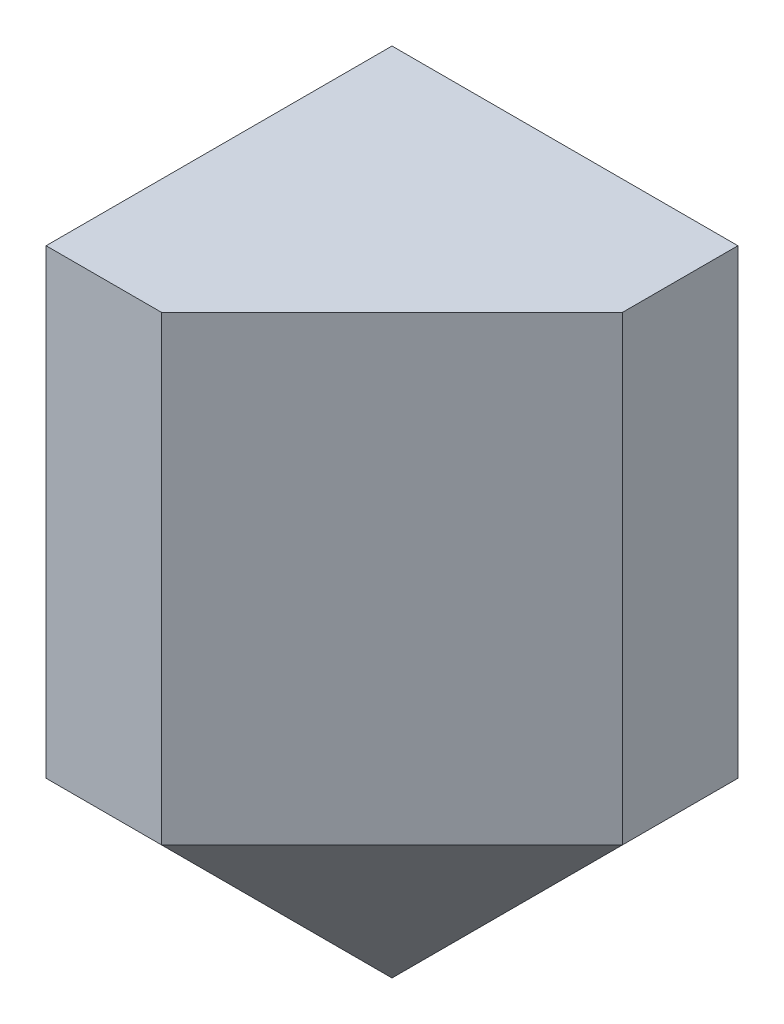
ISO-10303-21;
HEADER;
FILE_DESCRIPTION(('STEP AP214'),'2;1');
FILE_NAME('part.step','',(''),(''),'','','');
FILE_SCHEMA(('AUTOMOTIVE_DESIGN { 1 0 10303 214 1 1 1 1 }'));
ENDSEC;
DATA;
#1=APPLICATION_CONTEXT('core data for automotive mechanical design processes');
#2=APPLICATION_PROTOCOL_DEFINITION('international standard','automotive_design',2000,#1);
#3=PRODUCT_CONTEXT('',#1,'mechanical');
#4=PRODUCT('Part','Part','',(#3));
#5=PRODUCT_RELATED_PRODUCT_CATEGORY('part','',(#4));
#6=PRODUCT_DEFINITION_FORMATION('','',#4);
#7=PRODUCT_DEFINITION_CONTEXT('part definition',#1,'design');
#8=PRODUCT_DEFINITION('design','',#6,#7);
#9=PRODUCT_DEFINITION_SHAPE('','',#8);
#10=(LENGTH_UNIT() NAMED_UNIT(*) SI_UNIT(.MILLI.,.METRE.));
#11=(NAMED_UNIT(*) PLANE_ANGLE_UNIT() SI_UNIT($,.RADIAN.));
#12=(NAMED_UNIT(*) SI_UNIT($,.STERADIAN.) SOLID_ANGLE_UNIT());
#13=UNCERTAINTY_MEASURE_WITH_UNIT(LENGTH_MEASURE(1.E-05),#10,'distance_accuracy_value','');
#14=(GEOMETRIC_REPRESENTATION_CONTEXT(3) GLOBAL_UNCERTAINTY_ASSIGNED_CONTEXT((#13)) GLOBAL_UNIT_ASSIGNED_CONTEXT((#10,
#11,#12)) REPRESENTATION_CONTEXT('',''));
#15=CARTESIAN_POINT('',(0.,0.,0.));
#16=DIRECTION('',(0.,0.,1.));
#17=DIRECTION('',(1.,0.,0.));
#18=AXIS2_PLACEMENT_3D('',#15,#16,#17);
#19=CARTESIAN_POINT('',(0.,0.,30.));
#20=DIRECTION('',(1.,0.,0.));
#21=DIRECTION('',(0.,0.,-1.));
#22=AXIS2_PLACEMENT_3D('',#19,#20,#21);
#23=PLANE('',#22);
#24=CARTESIAN_POINT('',(0.,20.,18.));
#25=DIRECTION('',(-1.,0.,0.));
#26=DIRECTION('',(0.,0.,1.));
#27=AXIS2_PLACEMENT_3D('',#24,#25,#26);
#28=CIRCLE('',#27,2.74999999999999);
#29=CARTESIAN_POINT('',(0.,20.,20.75));
#30=VERTEX_POINT('',#29);
#31=EDGE_CURVE('E128',#30,#30,#28,.T.);
#32=ORIENTED_EDGE('',*,*,#31,.F.);
#33=EDGE_LOOP('',(#32));
#34=FACE_BOUND('',#33,.T.);
#35=CARTESIAN_POINT('',(0.,48.,18.));
#36=DIRECTION('',(-1.,0.,0.));
#37=DIRECTION('',(0.,0.,1.));
#38=AXIS2_PLACEMENT_3D('',#35,#36,#37);
#39=CIRCLE('',#38,2.75);
#40=CARTESIAN_POINT('',(0.,48.,20.75));
#41=VERTEX_POINT('',#40);
#42=EDGE_CURVE('E134',#41,#41,#39,.T.);
#43=ORIENTED_EDGE('',*,*,#42,.F.);
#44=EDGE_LOOP('',(#43));
#45=FACE_BOUND('',#44,.T.);
#46=DIRECTION('',(0.,0.,-1.));
#47=VECTOR('',#46,1.);
#48=CARTESIAN_POINT('',(0.,0.,30.));
#49=LINE('',#48,#47);
#50=CARTESIAN_POINT('',(0.,0.,9.99999999999995));
#51=VERTEX_POINT('',#50);
#52=CARTESIAN_POINT('',(0.,0.,0.));
#53=VERTEX_POINT('',#52);
#54=EDGE_CURVE('E159',#51,#53,#49,.T.);
#55=ORIENTED_EDGE('',*,*,#54,.F.);
#56=DIRECTION('',(0.,-0.707106781186546,-0.707106781186549));
#57=VECTOR('',#56,1.);
#58=CARTESIAN_POINT('',(0.,20.,30.));
#59=LINE('',#58,#57);
#60=CARTESIAN_POINT('',(0.,20.,30.));
#61=VERTEX_POINT('',#60);
#62=EDGE_CURVE('E11',#51,#61,#59,.F.);
#63=ORIENTED_EDGE('',*,*,#62,.T.);
#64=DIRECTION('',(0.,-1.,0.));
#65=VECTOR('',#64,1.);
#66=CARTESIAN_POINT('',(0.,0.,30.));
#67=LINE('',#66,#65);
#68=CARTESIAN_POINT('',(0.,60.,30.));
#69=VERTEX_POINT('',#68);
#70=EDGE_CURVE('E156',#69,#61,#67,.T.);
#71=ORIENTED_EDGE('',*,*,#70,.F.);
#72=DIRECTION('',(0.,0.,1.));
#73=VECTOR('',#72,1.);
#74=CARTESIAN_POINT('',(0.,60.,30.));
#75=LINE('',#74,#73);
#76=CARTESIAN_POINT('',(0.,60.,0.));
#77=VERTEX_POINT('',#76);
#78=EDGE_CURVE('E140',#77,#69,#75,.T.);
#79=ORIENTED_EDGE('',*,*,#78,.F.);
#80=DIRECTION('',(0.,-1.,0.));
#81=VECTOR('',#80,1.);
#82=CARTESIAN_POINT('',(0.,0.,0.));
#83=LINE('',#82,#81);
#84=EDGE_CURVE('E161',#77,#53,#83,.T.);
#85=ORIENTED_EDGE('',*,*,#84,.T.);
#86=EDGE_LOOP('',(#55,#63,#71,#79,#85));
#87=FACE_BOUND('',#86,.T.);
#88=ADVANCED_FACE('F41',(#34,#45,#87),#23,.F.);
#89=CARTESIAN_POINT('',(0.,0.,30.));
#90=DIRECTION('',(0.,1.,0.));
#91=DIRECTION('',(0.,0.,1.));
#92=AXIS2_PLACEMENT_3D('',#89,#90,#91);
#93=PLANE('',#92);
#94=DIRECTION('',(1.,0.,0.));
#95=VECTOR('',#94,1.);
#96=CARTESIAN_POINT('',(0.,0.,0.));
#97=LINE('',#96,#95);
#98=CARTESIAN_POINT('',(9.99999999999995,0.,0.));
#99=VERTEX_POINT('',#98);
#100=EDGE_CURVE('E164',#53,#99,#97,.T.);
#101=ORIENTED_EDGE('',*,*,#100,.T.);
#102=DIRECTION('',(0.,0.,1.));
#103=VECTOR('',#102,1.);
#104=CARTESIAN_POINT('',(9.99999999999995,0.,30.));
#105=LINE('',#104,#103);
#106=CARTESIAN_POINT('',(9.99999999999995,0.,9.99999999999995));
#107=VERTEX_POINT('',#106);
#108=EDGE_CURVE('E51',#99,#107,#105,.T.);
#109=ORIENTED_EDGE('',*,*,#108,.T.);
#110=DIRECTION('',(-1.,0.,0.));
#111=VECTOR('',#110,1.);
#112=CARTESIAN_POINT('',(0.,0.,9.99999999999995));
#113=LINE('',#112,#111);
#114=EDGE_CURVE('E62',#107,#51,#113,.T.);
#115=ORIENTED_EDGE('',*,*,#114,.T.);
#116=ORIENTED_EDGE('',*,*,#54,.T.);
#117=EDGE_LOOP('',(#101,#109,#115,#116));
#118=FACE_BOUND('',#117,.T.);
#119=ADVANCED_FACE('F217',(#118),#93,.F.);
#120=CARTESIAN_POINT('',(30.,0.,30.));
#121=DIRECTION('',(-1.,0.,0.));
#122=DIRECTION('',(0.,0.,1.));
#123=AXIS2_PLACEMENT_3D('',#120,#121,#122);
#124=PLANE('',#123);
#125=DIRECTION('',(0.,1.,0.));
#126=VECTOR('',#125,1.);
#127=CARTESIAN_POINT('',(30.,0.,0.));
#128=LINE('',#127,#126);
#129=CARTESIAN_POINT('',(30.,20.,0.));
#130=VERTEX_POINT('',#129);
#131=CARTESIAN_POINT('',(30.,60.,0.));
#132=VERTEX_POINT('',#131);
#133=EDGE_CURVE('E160',#130,#132,#128,.T.);
#134=ORIENTED_EDGE('',*,*,#133,.T.);
#135=DIRECTION('',(0.,0.,-1.));
#136=VECTOR('',#135,1.);
#137=CARTESIAN_POINT('',(30.,60.,0.));
#138=LINE('',#137,#136);
#139=CARTESIAN_POINT('',(30.,60.,9.99999999999992));
#140=VERTEX_POINT('',#139);
#141=EDGE_CURVE('E149',#140,#132,#138,.T.);
#142=ORIENTED_EDGE('',*,*,#141,.F.);
#143=DIRECTION('',(0.,-1.,0.));
#144=VECTOR('',#143,1.);
#145=CARTESIAN_POINT('',(30.,0.,9.99999999999995));
#146=LINE('',#145,#144);
#147=CARTESIAN_POINT('',(30.,20.,9.99999999999995));
#148=VERTEX_POINT('',#147);
#149=EDGE_CURVE('E174',#140,#148,#146,.T.);
#150=ORIENTED_EDGE('',*,*,#149,.T.);
#151=DIRECTION('',(0.,0.,-1.));
#152=VECTOR('',#151,1.);
#153=CARTESIAN_POINT('',(30.,20.,30.));
#154=LINE('',#153,#152);
#155=EDGE_CURVE('E172',#148,#130,#154,.T.);
#156=ORIENTED_EDGE('',*,*,#155,.T.);
#157=EDGE_LOOP('',(#134,#142,#150,#156));
#158=FACE_BOUND('',#157,.T.);
#159=ADVANCED_FACE('F223',(#158),#124,.F.);
#160=CARTESIAN_POINT('',(0.,0.,30.));
#161=DIRECTION('',(0.,0.,-1.));
#162=DIRECTION('',(-1.,0.,0.));
#163=AXIS2_PLACEMENT_3D('',#160,#161,#162);
#164=PLANE('',#163);
#165=DIRECTION('',(1.,0.,0.));
#166=VECTOR('',#165,1.);
#167=CARTESIAN_POINT('',(0.,20.,30.));
#168=LINE('',#167,#166);
#169=CARTESIAN_POINT('',(10.,20.,30.));
#170=VERTEX_POINT('',#169);
#171=EDGE_CURVE('E168',#61,#170,#168,.T.);
#172=ORIENTED_EDGE('',*,*,#171,.T.);
#173=DIRECTION('',(0.,1.,0.));
#174=VECTOR('',#173,1.);
#175=CARTESIAN_POINT('',(10.,0.,30.));
#176=LINE('',#175,#174);
#177=CARTESIAN_POINT('',(9.99999999999999,60.,30.));
#178=VERTEX_POINT('',#177);
#179=EDGE_CURVE('E170',#170,#178,#176,.T.);
#180=ORIENTED_EDGE('',*,*,#179,.T.);
#181=DIRECTION('',(1.,0.,0.));
#182=VECTOR('',#181,1.);
#183=CARTESIAN_POINT('',(9.99999999999999,60.,30.));
#184=LINE('',#183,#182);
#185=EDGE_CURVE('E143',#69,#178,#184,.T.);
#186=ORIENTED_EDGE('',*,*,#185,.F.);
#187=ORIENTED_EDGE('',*,*,#70,.T.);
#188=EDGE_LOOP('',(#172,#180,#186,#187));
#189=FACE_BOUND('',#188,.T.);
#190=ADVANCED_FACE('F197',(#189),#164,.F.);
#191=CARTESIAN_POINT('',(0.,0.,0.));
#192=DIRECTION('',(0.,0.,-1.));
#193=DIRECTION('',(-1.,0.,0.));
#194=AXIS2_PLACEMENT_3D('',#191,#192,#193);
#195=PLANE('',#194);
#196=CARTESIAN_POINT('',(18.,20.,0.));
#197=DIRECTION('',(0.,0.,-1.));
#198=DIRECTION('',(-1.,0.,0.));
#199=AXIS2_PLACEMENT_3D('',#196,#197,#198);
#200=CIRCLE('',#199,2.74999999999999);
#201=CARTESIAN_POINT('',(15.25,20.,0.));
#202=VERTEX_POINT('',#201);
#203=EDGE_CURVE('E118',#202,#202,#200,.T.);
#204=ORIENTED_EDGE('',*,*,#203,.F.);
#205=EDGE_LOOP('',(#204));
#206=FACE_BOUND('',#205,.T.);
#207=CARTESIAN_POINT('',(14.,48.,0.));
#208=DIRECTION('',(0.,0.,-1.));
#209=DIRECTION('',(-1.,0.,0.));
#210=AXIS2_PLACEMENT_3D('',#207,#208,#209);
#211=CIRCLE('',#210,2.74999999999999);
#212=CARTESIAN_POINT('',(11.25,48.,0.));
#213=VERTEX_POINT('',#212);
#214=EDGE_CURVE('E117',#213,#213,#211,.T.);
#215=ORIENTED_EDGE('',*,*,#214,.F.);
#216=EDGE_LOOP('',(#215));
#217=FACE_BOUND('',#216,.T.);
#218=ORIENTED_EDGE('',*,*,#133,.F.);
#219=DIRECTION('',(0.707106781186549,0.707106781186546,0.));
#220=VECTOR('',#219,1.);
#221=CARTESIAN_POINT('',(4.99999999999996,-4.99999999999997,0.));
#222=LINE('',#221,#220);
#223=EDGE_CURVE('E176',#130,#99,#222,.F.);
#224=ORIENTED_EDGE('',*,*,#223,.T.);
#225=ORIENTED_EDGE('',*,*,#100,.F.);
#226=ORIENTED_EDGE('',*,*,#84,.F.);
#227=DIRECTION('',(-1.,0.,0.));
#228=VECTOR('',#227,1.);
#229=CARTESIAN_POINT('',(0.,60.,0.));
#230=LINE('',#229,#228);
#231=EDGE_CURVE('E152',#132,#77,#230,.T.);
#232=ORIENTED_EDGE('',*,*,#231,.F.);
#233=EDGE_LOOP('',(#218,#224,#225,#226,#232));
#234=FACE_BOUND('',#233,.T.);
#235=ADVANCED_FACE('F214',(#206,#217,#234),#195,.T.);
#236=CARTESIAN_POINT('',(30.,20.,30.));
#237=DIRECTION('',(-0.707106781186546,0.707106781186549,0.));
#238=DIRECTION('',(0.,0.,-1.));
#239=AXIS2_PLACEMENT_3D('',#236,#237,#238);
#240=PLANE('',#239);
#241=ORIENTED_EDGE('',*,*,#223,.F.);
#242=ORIENTED_EDGE('',*,*,#155,.F.);
#243=DIRECTION('',(-0.707106781186549,-0.707106781186546,0.));
#244=VECTOR('',#243,1.);
#245=CARTESIAN_POINT('',(30.,20.,9.99999999999995));
#246=LINE('',#245,#244);
#247=EDGE_CURVE('E46',#107,#148,#246,.F.);
#248=ORIENTED_EDGE('',*,*,#247,.F.);
#249=ORIENTED_EDGE('',*,*,#108,.F.);
#250=EDGE_LOOP('',(#241,#242,#248,#249));
#251=FACE_BOUND('',#250,.T.);
#252=ADVANCED_FACE('F44',(#251),#240,.F.);
#253=CARTESIAN_POINT('',(0.,20.,30.));
#254=DIRECTION('',(0.,0.707106781186549,-0.707106781186546));
#255=DIRECTION('',(1.,0.,0.));
#256=AXIS2_PLACEMENT_3D('',#253,#254,#255);
#257=PLANE('',#256);
#258=ORIENTED_EDGE('',*,*,#62,.F.);
#259=ORIENTED_EDGE('',*,*,#114,.F.);
#260=DIRECTION('',(0.,0.707106781186546,0.707106781186549));
#261=VECTOR('',#260,1.);
#262=CARTESIAN_POINT('',(9.99999999999998,10.,20.));
#263=LINE('',#262,#261);
#264=EDGE_CURVE('E181',#170,#107,#263,.F.);
#265=ORIENTED_EDGE('',*,*,#264,.F.);
#266=ORIENTED_EDGE('',*,*,#171,.F.);
#267=EDGE_LOOP('',(#258,#259,#265,#266));
#268=FACE_BOUND('',#267,.T.);
#269=ADVANCED_FACE('F207',(#268),#257,.F.);
#270=CARTESIAN_POINT('',(30.,20.,9.99999999999995));
#271=DIRECTION('',(0.577350269189626,-0.577350269189628,0.577350269189624));
#272=DIRECTION('',(0.707106781186549,0.707106781186546,0.));
#273=AXIS2_PLACEMENT_3D('',#270,#271,#272);
#274=PLANE('',#273);
#275=ORIENTED_EDGE('',*,*,#264,.T.);
#276=ORIENTED_EDGE('',*,*,#247,.T.);
#277=DIRECTION('',(0.707106781186546,0.,-0.707106781186549));
#278=VECTOR('',#277,1.);
#279=CARTESIAN_POINT('',(30.,20.,9.99999999999995));
#280=LINE('',#279,#278);
#281=EDGE_CURVE('E155',#170,#148,#280,.T.);
#282=ORIENTED_EDGE('',*,*,#281,.F.);
#283=EDGE_LOOP('',(#275,#276,#282));
#284=FACE_BOUND('',#283,.T.);
#285=ADVANCED_FACE('F188',(#284),#274,.T.);
#286=CARTESIAN_POINT('',(10.,0.,30.));
#287=DIRECTION('',(-0.707106781186549,0.,-0.707106781186546));
#288=DIRECTION('',(0.,1.,0.));
#289=AXIS2_PLACEMENT_3D('',#286,#287,#288);
#290=PLANE('',#289);
#291=ORIENTED_EDGE('',*,*,#281,.T.);
#292=ORIENTED_EDGE('',*,*,#149,.F.);
#293=DIRECTION('',(0.707106781186546,0.,-0.707106781186549));
#294=VECTOR('',#293,1.);
#295=CARTESIAN_POINT('',(30.,60.,9.99999999999992));
#296=LINE('',#295,#294);
#297=EDGE_CURVE('E146',#178,#140,#296,.T.);
#298=ORIENTED_EDGE('',*,*,#297,.F.);
#299=ORIENTED_EDGE('',*,*,#179,.F.);
#300=EDGE_LOOP('',(#291,#292,#298,#299));
#301=FACE_BOUND('',#300,.T.);
#302=ADVANCED_FACE('F193',(#301),#290,.F.);
#303=CARTESIAN_POINT('',(0.,60.,0.));
#304=DIRECTION('',(0.,-1.,0.));
#305=DIRECTION('',(0.,0.,-1.));
#306=AXIS2_PLACEMENT_3D('',#303,#304,#305);
#307=PLANE('',#306);
#308=ORIENTED_EDGE('',*,*,#78,.T.);
#309=ORIENTED_EDGE('',*,*,#185,.T.);
#310=ORIENTED_EDGE('',*,*,#297,.T.);
#311=ORIENTED_EDGE('',*,*,#141,.T.);
#312=ORIENTED_EDGE('',*,*,#231,.T.);
#313=EDGE_LOOP('',(#308,#309,#310,#311,#312));
#314=FACE_BOUND('',#313,.T.);
#315=ADVANCED_FACE('F200',(#314),#307,.F.);
#316=CARTESIAN_POINT('',(13.,48.,18.));
#317=DIRECTION('',(-1.,0.,0.));
#318=DIRECTION('',(0.,0.,1.));
#319=AXIS2_PLACEMENT_3D('',#316,#317,#318);
#320=CONICAL_SURFACE('',#319,2.75,1.02974425867665);
#321=CARTESIAN_POINT('',(14.6523667023258,48.,18.));
#322=VERTEX_POINT('',#321);
#323=VERTEX_LOOP('',#322);
#324=FACE_BOUND('',#323,.T.);
#325=CARTESIAN_POINT('',(13.,48.,18.));
#326=DIRECTION('',(-1.,0.,0.));
#327=DIRECTION('',(0.,0.,1.));
#328=AXIS2_PLACEMENT_3D('',#325,#326,#327);
#329=CIRCLE('',#328,2.75);
#330=CARTESIAN_POINT('',(13.,48.,20.75));
#331=VERTEX_POINT('',#330);
#332=EDGE_CURVE('E137',#331,#331,#329,.T.);
#333=ORIENTED_EDGE('',*,*,#332,.T.);
#334=EDGE_LOOP('',(#333));
#335=FACE_BOUND('',#334,.T.);
#336=ADVANCED_FACE('F243',(#324,#335),#320,.F.);
#337=CARTESIAN_POINT('',(0.,48.,18.));
#338=DIRECTION('',(-1.,0.,0.));
#339=DIRECTION('',(0.,0.,1.));
#340=AXIS2_PLACEMENT_3D('',#337,#338,#339);
#341=CYLINDRICAL_SURFACE('',#340,2.75);
#342=ORIENTED_EDGE('',*,*,#332,.F.);
#343=EDGE_LOOP('',(#342));
#344=FACE_BOUND('',#343,.T.);
#345=ORIENTED_EDGE('',*,*,#42,.T.);
#346=EDGE_LOOP('',(#345));
#347=FACE_BOUND('',#346,.T.);
#348=ADVANCED_FACE('F248',(#344,#347),#341,.F.);
#349=CARTESIAN_POINT('',(13.,20.,18.));
#350=DIRECTION('',(-1.,0.,0.));
#351=DIRECTION('',(0.,0.,1.));
#352=AXIS2_PLACEMENT_3D('',#349,#350,#351);
#353=CONICAL_SURFACE('',#352,2.75,1.02974425867665);
#354=CARTESIAN_POINT('',(14.6523667023258,20.,18.));
#355=VERTEX_POINT('',#354);
#356=VERTEX_LOOP('',#355);
#357=FACE_BOUND('',#356,.T.);
#358=CARTESIAN_POINT('',(13.,20.,18.));
#359=DIRECTION('',(-1.,0.,0.));
#360=DIRECTION('',(0.,0.,1.));
#361=AXIS2_PLACEMENT_3D('',#358,#359,#360);
#362=CIRCLE('',#361,2.75);
#363=CARTESIAN_POINT('',(13.,20.,20.75));
#364=VERTEX_POINT('',#363);
#365=EDGE_CURVE('E131',#364,#364,#362,.T.);
#366=ORIENTED_EDGE('',*,*,#365,.T.);
#367=EDGE_LOOP('',(#366));
#368=FACE_BOUND('',#367,.T.);
#369=ADVANCED_FACE('F360',(#357,#368),#353,.F.);
#370=CARTESIAN_POINT('',(0.,20.,18.));
#371=DIRECTION('',(-1.,0.,0.));
#372=DIRECTION('',(0.,0.,1.));
#373=AXIS2_PLACEMENT_3D('',#370,#371,#372);
#374=CYLINDRICAL_SURFACE('',#373,2.74999999999999);
#375=ORIENTED_EDGE('',*,*,#365,.F.);
#376=EDGE_LOOP('',(#375));
#377=FACE_BOUND('',#376,.T.);
#378=ORIENTED_EDGE('',*,*,#31,.T.);
#379=EDGE_LOOP('',(#378));
#380=FACE_BOUND('',#379,.T.);
#381=ADVANCED_FACE('F369',(#377,#380),#374,.F.);
#382=CARTESIAN_POINT('',(14.,48.,13.));
#383=DIRECTION('',(0.,0.,-1.));
#384=DIRECTION('',(-1.,0.,0.));
#385=AXIS2_PLACEMENT_3D('',#382,#383,#384);
#386=CONICAL_SURFACE('',#385,2.75,1.02974425867665);
#387=CARTESIAN_POINT('',(14.,48.,14.6523667023258));
#388=VERTEX_POINT('',#387);
#389=VERTEX_LOOP('',#388);
#390=FACE_BOUND('',#389,.T.);
#391=CARTESIAN_POINT('',(14.,48.,13.));
#392=DIRECTION('',(0.,0.,-1.));
#393=DIRECTION('',(-1.,0.,0.));
#394=AXIS2_PLACEMENT_3D('',#391,#392,#393);
#395=CIRCLE('',#394,2.75);
#396=CARTESIAN_POINT('',(11.25,48.,13.));
#397=VERTEX_POINT('',#396);
#398=EDGE_CURVE('E121',#397,#397,#395,.T.);
#399=ORIENTED_EDGE('',*,*,#398,.T.);
#400=EDGE_LOOP('',(#399));
#401=FACE_BOUND('',#400,.T.);
#402=ADVANCED_FACE('F379',(#390,#401),#386,.F.);
#403=CARTESIAN_POINT('',(14.,48.,0.));
#404=DIRECTION('',(0.,0.,-1.));
#405=DIRECTION('',(-1.,0.,0.));
#406=AXIS2_PLACEMENT_3D('',#403,#404,#405);
#407=CYLINDRICAL_SURFACE('',#406,2.74999999999999);
#408=ORIENTED_EDGE('',*,*,#398,.F.);
#409=EDGE_LOOP('',(#408));
#410=FACE_BOUND('',#409,.T.);
#411=ORIENTED_EDGE('',*,*,#214,.T.);
#412=EDGE_LOOP('',(#411));
#413=FACE_BOUND('',#412,.T.);
#414=ADVANCED_FACE('F111',(#410,#413),#407,.F.);
#415=CARTESIAN_POINT('',(18.,20.,13.));
#416=DIRECTION('',(0.,0.,-1.));
#417=DIRECTION('',(-1.,0.,0.));
#418=AXIS2_PLACEMENT_3D('',#415,#416,#417);
#419=CONICAL_SURFACE('',#418,2.75,1.02974425867665);
#420=CARTESIAN_POINT('',(18.,20.,14.6523667023258));
#421=VERTEX_POINT('',#420);
#422=VERTEX_LOOP('',#421);
#423=FACE_BOUND('',#422,.T.);
#424=CARTESIAN_POINT('',(18.,20.,13.));
#425=DIRECTION('',(0.,0.,-1.));
#426=DIRECTION('',(-1.,0.,0.));
#427=AXIS2_PLACEMENT_3D('',#424,#425,#426);
#428=CIRCLE('',#427,2.75);
#429=CARTESIAN_POINT('',(15.25,20.,13.));
#430=VERTEX_POINT('',#429);
#431=EDGE_CURVE('E115',#430,#430,#428,.T.);
#432=ORIENTED_EDGE('',*,*,#431,.T.);
#433=EDGE_LOOP('',(#432));
#434=FACE_BOUND('',#433,.T.);
#435=ADVANCED_FACE('F107',(#423,#434),#419,.F.);
#436=CARTESIAN_POINT('',(18.,20.,0.));
#437=DIRECTION('',(0.,0.,-1.));
#438=DIRECTION('',(-1.,0.,0.));
#439=AXIS2_PLACEMENT_3D('',#436,#437,#438);
#440=CYLINDRICAL_SURFACE('',#439,2.74999999999999);
#441=ORIENTED_EDGE('',*,*,#431,.F.);
#442=EDGE_LOOP('',(#441));
#443=FACE_BOUND('',#442,.T.);
#444=ORIENTED_EDGE('',*,*,#203,.T.);
#445=EDGE_LOOP('',(#444));
#446=FACE_BOUND('',#445,.T.);
#447=ADVANCED_FACE('F110',(#443,#446),#440,.F.);
#448=CLOSED_SHELL('',(#88,#119,#159,#190,#235,#252,#269,#285,#302,#315,#336,#348,#369,#381,#402,
#414,#435,#447));
#449=MANIFOLD_SOLID_BREP('B2',#448);
#450=ADVANCED_BREP_SHAPE_REPRESENTATION('',(#18,#449),#14);
#451=SHAPE_DEFINITION_REPRESENTATION(#9,#450);
ENDSEC;
END-ISO-10303-21;
